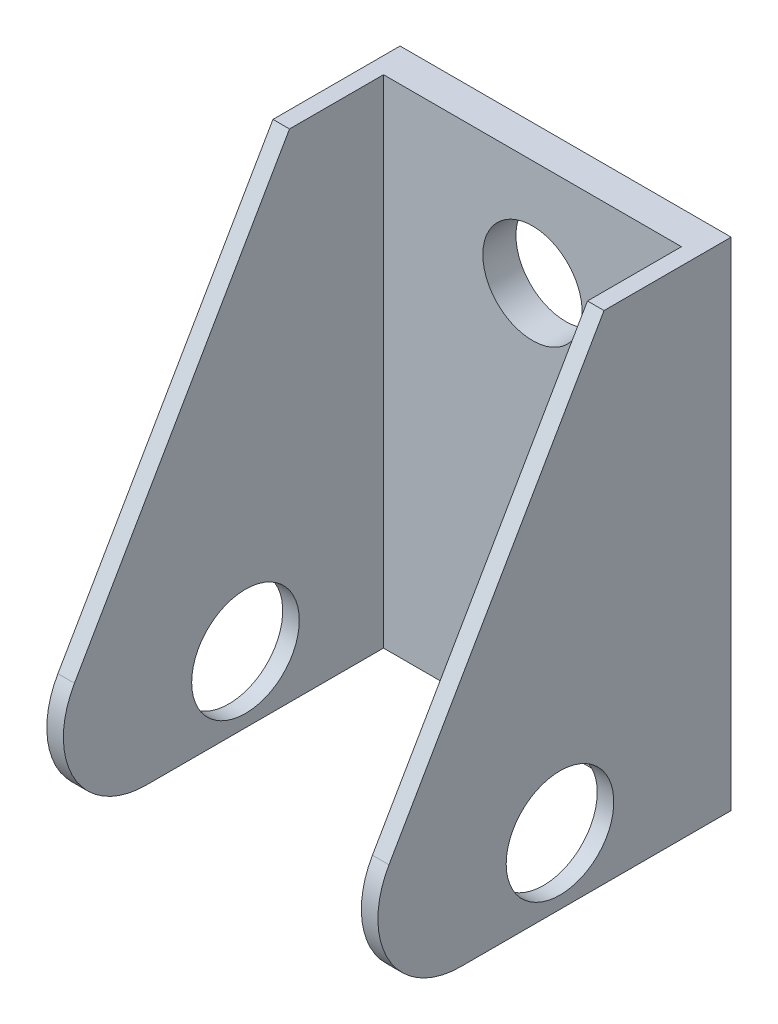
ISO-10303-21;
HEADER;
FILE_DESCRIPTION(('STEP AP214'),'2;1');
FILE_NAME('part.step','',(''),(''),'','','');
FILE_SCHEMA(('AUTOMOTIVE_DESIGN { 1 0 10303 214 1 1 1 1 }'));
ENDSEC;
DATA;
#1=APPLICATION_CONTEXT('core data for automotive mechanical design processes');
#2=APPLICATION_PROTOCOL_DEFINITION('international standard','automotive_design',2000,#1);
#3=PRODUCT_CONTEXT('',#1,'mechanical');
#4=PRODUCT('Part','Part','',(#3));
#5=PRODUCT_RELATED_PRODUCT_CATEGORY('part','',(#4));
#6=PRODUCT_DEFINITION_FORMATION('','',#4);
#7=PRODUCT_DEFINITION_CONTEXT('part definition',#1,'design');
#8=PRODUCT_DEFINITION('design','',#6,#7);
#9=PRODUCT_DEFINITION_SHAPE('','',#8);
#10=(LENGTH_UNIT() NAMED_UNIT(*) SI_UNIT(.MILLI.,.METRE.));
#11=(NAMED_UNIT(*) PLANE_ANGLE_UNIT() SI_UNIT($,.RADIAN.));
#12=(NAMED_UNIT(*) SI_UNIT($,.STERADIAN.) SOLID_ANGLE_UNIT());
#13=UNCERTAINTY_MEASURE_WITH_UNIT(LENGTH_MEASURE(1.E-05),#10,'distance_accuracy_value','');
#14=(GEOMETRIC_REPRESENTATION_CONTEXT(3) GLOBAL_UNCERTAINTY_ASSIGNED_CONTEXT((#13)) GLOBAL_UNIT_ASSIGNED_CONTEXT((#10,
#11,#12)) REPRESENTATION_CONTEXT('',''));
#15=CARTESIAN_POINT('',(0.,0.,0.));
#16=DIRECTION('',(0.,0.,1.));
#17=DIRECTION('',(1.,0.,0.));
#18=AXIS2_PLACEMENT_3D('',#15,#16,#17);
#19=CARTESIAN_POINT('',(10.,-15.,2.));
#20=DIRECTION('',(-1.,0.,0.));
#21=DIRECTION('',(0.,0.,1.));
#22=AXIS2_PLACEMENT_3D('',#19,#20,#21);
#23=PLANE('',#22);
#24=CARTESIAN_POINT('',(10.,-11.,10.3397459621556));
#25=DIRECTION('',(-1.,0.,0.));
#26=DIRECTION('',(0.,0.,1.));
#27=AXIS2_PLACEMENT_3D('',#24,#25,#26);
#28=CIRCLE('',#27,3.25);
#29=CARTESIAN_POINT('',(10.,-11.,13.5897459621556));
#30=VERTEX_POINT('',#29);
#31=EDGE_CURVE('E308',#30,#30,#28,.T.);
#32=ORIENTED_EDGE('',*,*,#31,.T.);
#33=EDGE_LOOP('',(#32));
#34=FACE_BOUND('',#33,.T.);
#35=DIRECTION('',(0.,-0.866025403784436,0.500000000000004));
#36=VECTOR('',#35,1.);
#37=CARTESIAN_POINT('',(10.,-15.,25.));
#38=LINE('',#37,#36);
#39=CARTESIAN_POINT('',(10.,15.,7.67949192431104));
#40=VERTEX_POINT('',#39);
#41=CARTESIAN_POINT('',(10.,-7.49999999999998,20.6698729810777));
#42=VERTEX_POINT('',#41);
#43=EDGE_CURVE('E141',#40,#42,#38,.T.);
#44=ORIENTED_EDGE('',*,*,#43,.T.);
#45=CARTESIAN_POINT('',(10.,-9.99999999999999,16.3397459621556));
#46=DIRECTION('',(-1.,0.,0.));
#47=DIRECTION('',(0.,0.,1.));
#48=AXIS2_PLACEMENT_3D('',#45,#46,#47);
#49=CIRCLE('',#48,5.);
#50=CARTESIAN_POINT('',(10.,-15.,16.3397459621556));
#51=VERTEX_POINT('',#50);
#52=EDGE_CURVE('E63',#42,#51,#49,.F.);
#53=ORIENTED_EDGE('',*,*,#52,.T.);
#54=DIRECTION('',(0.,0.,-1.));
#55=VECTOR('',#54,1.);
#56=CARTESIAN_POINT('',(10.,-15.,2.));
#57=LINE('',#56,#55);
#58=CARTESIAN_POINT('',(10.,-15.,0.));
#59=VERTEX_POINT('',#58);
#60=EDGE_CURVE('E195',#51,#59,#57,.T.);
#61=ORIENTED_EDGE('',*,*,#60,.T.);
#62=DIRECTION('',(0.,1.,0.));
#63=VECTOR('',#62,1.);
#64=CARTESIAN_POINT('',(10.,-15.,0.));
#65=LINE('',#64,#63);
#66=CARTESIAN_POINT('',(10.,15.,0.));
#67=VERTEX_POINT('',#66);
#68=EDGE_CURVE('E185',#59,#67,#65,.T.);
#69=ORIENTED_EDGE('',*,*,#68,.T.);
#70=DIRECTION('',(0.,0.,-1.));
#71=VECTOR('',#70,1.);
#72=CARTESIAN_POINT('',(10.,15.,2.));
#73=LINE('',#72,#71);
#74=EDGE_CURVE('E128',#40,#67,#73,.T.);
#75=ORIENTED_EDGE('',*,*,#74,.F.);
#76=EDGE_LOOP('',(#44,#53,#61,#69,#75));
#77=FACE_BOUND('',#76,.T.);
#78=ADVANCED_FACE('F39',(#34,#77),#23,.F.);
#79=CARTESIAN_POINT('',(-10.,15.,2.));
#80=DIRECTION('',(0.,-1.,0.));
#81=DIRECTION('',(0.,0.,-1.));
#82=AXIS2_PLACEMENT_3D('',#79,#80,#81);
#83=PLANE('',#82);
#84=DIRECTION('',(-1.,0.,0.));
#85=VECTOR('',#84,1.);
#86=CARTESIAN_POINT('',(-10.,15.,0.));
#87=LINE('',#86,#85);
#88=CARTESIAN_POINT('',(-10.,15.,0.));
#89=VERTEX_POINT('',#88);
#90=EDGE_CURVE('E122',#67,#89,#87,.T.);
#91=ORIENTED_EDGE('',*,*,#90,.T.);
#92=DIRECTION('',(0.,0.,-1.));
#93=VECTOR('',#92,1.);
#94=CARTESIAN_POINT('',(-10.,15.,2.));
#95=LINE('',#94,#93);
#96=CARTESIAN_POINT('',(-10.,15.,7.67949192431104));
#97=VERTEX_POINT('',#96);
#98=EDGE_CURVE('E115',#97,#89,#95,.T.);
#99=ORIENTED_EDGE('',*,*,#98,.F.);
#100=DIRECTION('',(1.,0.,0.));
#101=VECTOR('',#100,1.);
#102=CARTESIAN_POINT('',(-10.,15.,7.67949192431104));
#103=LINE('',#102,#101);
#104=CARTESIAN_POINT('',(-9.,15.,7.67949192431104));
#105=VERTEX_POINT('',#104);
#106=EDGE_CURVE('E119',#97,#105,#103,.T.);
#107=ORIENTED_EDGE('',*,*,#106,.T.);
#108=DIRECTION('',(0.,0.,1.));
#109=VECTOR('',#108,1.);
#110=CARTESIAN_POINT('',(-9.,15.,2.));
#111=LINE('',#110,#109);
#112=CARTESIAN_POINT('',(-9.,15.,2.));
#113=VERTEX_POINT('',#112);
#114=EDGE_CURVE('E148',#113,#105,#111,.T.);
#115=ORIENTED_EDGE('',*,*,#114,.F.);
#116=DIRECTION('',(-1.,0.,0.));
#117=VECTOR('',#116,1.);
#118=CARTESIAN_POINT('',(-10.,15.,2.));
#119=LINE('',#118,#117);
#120=CARTESIAN_POINT('',(9.,15.,2.));
#121=VERTEX_POINT('',#120);
#122=EDGE_CURVE('E186',#121,#113,#119,.T.);
#123=ORIENTED_EDGE('',*,*,#122,.F.);
#124=DIRECTION('',(0.,0.,1.));
#125=VECTOR('',#124,1.);
#126=CARTESIAN_POINT('',(9.,15.,2.));
#127=LINE('',#126,#125);
#128=CARTESIAN_POINT('',(9.,15.,7.67949192431104));
#129=VERTEX_POINT('',#128);
#130=EDGE_CURVE('E175',#121,#129,#127,.T.);
#131=ORIENTED_EDGE('',*,*,#130,.T.);
#132=DIRECTION('',(1.,0.,0.));
#133=VECTOR('',#132,1.);
#134=CARTESIAN_POINT('',(9.,15.,7.67949192431104));
#135=LINE('',#134,#133);
#136=EDGE_CURVE('E179',#129,#40,#135,.T.);
#137=ORIENTED_EDGE('',*,*,#136,.T.);
#138=ORIENTED_EDGE('',*,*,#74,.T.);
#139=EDGE_LOOP('',(#91,#99,#107,#115,#123,#131,#137,#138));
#140=FACE_BOUND('',#139,.T.);
#141=ADVANCED_FACE('F117',(#140),#83,.F.);
#142=CARTESIAN_POINT('',(-10.,-15.,2.));
#143=DIRECTION('',(1.,0.,0.));
#144=DIRECTION('',(0.,0.,-1.));
#145=AXIS2_PLACEMENT_3D('',#142,#143,#144);
#146=PLANE('',#145);
#147=CARTESIAN_POINT('',(-10.,-11.,10.3397459621556));
#148=DIRECTION('',(-1.,0.,0.));
#149=DIRECTION('',(0.,0.,1.));
#150=AXIS2_PLACEMENT_3D('',#147,#148,#149);
#151=CIRCLE('',#150,3.25);
#152=CARTESIAN_POINT('',(-10.,-11.,13.5897459621556));
#153=VERTEX_POINT('',#152);
#154=EDGE_CURVE('E303',#153,#153,#151,.T.);
#155=ORIENTED_EDGE('',*,*,#154,.F.);
#156=EDGE_LOOP('',(#155));
#157=FACE_BOUND('',#156,.T.);
#158=DIRECTION('',(0.,0.,-1.));
#159=VECTOR('',#158,1.);
#160=CARTESIAN_POINT('',(-10.,-15.,2.));
#161=LINE('',#160,#159);
#162=CARTESIAN_POINT('',(-10.,-15.,16.3397459621556));
#163=VERTEX_POINT('',#162);
#164=CARTESIAN_POINT('',(-10.,-15.,0.));
#165=VERTEX_POINT('',#164);
#166=EDGE_CURVE('E129',#163,#165,#161,.T.);
#167=ORIENTED_EDGE('',*,*,#166,.F.);
#168=CARTESIAN_POINT('',(-10.,-9.99999999999999,16.3397459621556));
#169=DIRECTION('',(1.,0.,0.));
#170=DIRECTION('',(0.,0.,-1.));
#171=AXIS2_PLACEMENT_3D('',#168,#169,#170);
#172=CIRCLE('',#171,5.);
#173=CARTESIAN_POINT('',(-10.,-7.49999999999998,20.6698729810777));
#174=VERTEX_POINT('',#173);
#175=EDGE_CURVE('E146',#163,#174,#172,.F.);
#176=ORIENTED_EDGE('',*,*,#175,.T.);
#177=DIRECTION('',(0.,-0.866025403784436,0.500000000000004));
#178=VECTOR('',#177,1.);
#179=CARTESIAN_POINT('',(-10.,-15.,25.));
#180=LINE('',#179,#178);
#181=EDGE_CURVE('E135',#97,#174,#180,.T.);
#182=ORIENTED_EDGE('',*,*,#181,.F.);
#183=ORIENTED_EDGE('',*,*,#98,.T.);
#184=DIRECTION('',(0.,-1.,0.));
#185=VECTOR('',#184,1.);
#186=CARTESIAN_POINT('',(-10.,-15.,0.));
#187=LINE('',#186,#185);
#188=EDGE_CURVE('E201',#89,#165,#187,.T.);
#189=ORIENTED_EDGE('',*,*,#188,.T.);
#190=EDGE_LOOP('',(#167,#176,#182,#183,#189));
#191=FACE_BOUND('',#190,.T.);
#192=ADVANCED_FACE('F144',(#157,#191),#146,.F.);
#193=CARTESIAN_POINT('',(-10.,-15.,2.));
#194=DIRECTION('',(0.,1.,0.));
#195=DIRECTION('',(0.,0.,1.));
#196=AXIS2_PLACEMENT_3D('',#193,#194,#195);
#197=PLANE('',#196);
#198=ORIENTED_EDGE('',*,*,#60,.F.);
#199=DIRECTION('',(1.,0.,0.));
#200=VECTOR('',#199,1.);
#201=CARTESIAN_POINT('',(9.,-15.,16.3397459621556));
#202=LINE('',#201,#200);
#203=CARTESIAN_POINT('',(9.,-15.,16.3397459621556));
#204=VERTEX_POINT('',#203);
#205=EDGE_CURVE('E49',#51,#204,#202,.F.);
#206=ORIENTED_EDGE('',*,*,#205,.T.);
#207=DIRECTION('',(0.,0.,-1.));
#208=VECTOR('',#207,1.);
#209=CARTESIAN_POINT('',(9.,-15.,2.));
#210=LINE('',#209,#208);
#211=CARTESIAN_POINT('',(9.,-15.,2.));
#212=VERTEX_POINT('',#211);
#213=EDGE_CURVE('E168',#204,#212,#210,.T.);
#214=ORIENTED_EDGE('',*,*,#213,.T.);
#215=DIRECTION('',(1.,0.,0.));
#216=VECTOR('',#215,1.);
#217=CARTESIAN_POINT('',(-10.,-15.,2.));
#218=LINE('',#217,#216);
#219=CARTESIAN_POINT('',(-9.,-15.,2.));
#220=VERTEX_POINT('',#219);
#221=EDGE_CURVE('E190',#220,#212,#218,.T.);
#222=ORIENTED_EDGE('',*,*,#221,.F.);
#223=DIRECTION('',(0.,0.,-1.));
#224=VECTOR('',#223,1.);
#225=CARTESIAN_POINT('',(-9.,-15.,2.));
#226=LINE('',#225,#224);
#227=CARTESIAN_POINT('',(-9.,-15.,16.3397459621556));
#228=VERTEX_POINT('',#227);
#229=EDGE_CURVE('E159',#228,#220,#226,.T.);
#230=ORIENTED_EDGE('',*,*,#229,.F.);
#231=DIRECTION('',(1.,0.,0.));
#232=VECTOR('',#231,1.);
#233=CARTESIAN_POINT('',(-10.,-15.,16.3397459621556));
#234=LINE('',#233,#232);
#235=EDGE_CURVE('E219',#228,#163,#234,.F.);
#236=ORIENTED_EDGE('',*,*,#235,.T.);
#237=ORIENTED_EDGE('',*,*,#166,.T.);
#238=DIRECTION('',(1.,0.,0.));
#239=VECTOR('',#238,1.);
#240=CARTESIAN_POINT('',(-10.,-15.,0.));
#241=LINE('',#240,#239);
#242=EDGE_CURVE('E191',#165,#59,#241,.T.);
#243=ORIENTED_EDGE('',*,*,#242,.T.);
#244=EDGE_LOOP('',(#198,#206,#214,#222,#230,#236,#237,#243));
#245=FACE_BOUND('',#244,.T.);
#246=ADVANCED_FACE('F266',(#245),#197,.F.);
#247=CARTESIAN_POINT('',(0.,0.,2.));
#248=DIRECTION('',(0.,0.,-1.));
#249=DIRECTION('',(-1.,0.,0.));
#250=AXIS2_PLACEMENT_3D('',#247,#248,#249);
#251=PLANE('',#250);
#252=CARTESIAN_POINT('',(0.,8.58887652225349,2.));
#253=DIRECTION('',(0.,0.,-1.));
#254=DIRECTION('',(-1.,0.,0.));
#255=AXIS2_PLACEMENT_3D('',#252,#253,#254);
#256=CIRCLE('',#255,3.);
#257=CARTESIAN_POINT('',(-3.,8.58887652225349,2.));
#258=VERTEX_POINT('',#257);
#259=EDGE_CURVE('E301',#258,#258,#256,.T.);
#260=ORIENTED_EDGE('',*,*,#259,.T.);
#261=EDGE_LOOP('',(#260));
#262=FACE_BOUND('',#261,.T.);
#263=ORIENTED_EDGE('',*,*,#122,.T.);
#264=DIRECTION('',(0.,1.,0.));
#265=VECTOR('',#264,1.);
#266=CARTESIAN_POINT('',(-9.,15.,2.));
#267=LINE('',#266,#265);
#268=EDGE_CURVE('E151',#220,#113,#267,.T.);
#269=ORIENTED_EDGE('',*,*,#268,.F.);
#270=ORIENTED_EDGE('',*,*,#221,.T.);
#271=DIRECTION('',(0.,1.,0.));
#272=VECTOR('',#271,1.);
#273=CARTESIAN_POINT('',(9.,15.,2.));
#274=LINE('',#273,#272);
#275=EDGE_CURVE('E171',#212,#121,#274,.T.);
#276=ORIENTED_EDGE('',*,*,#275,.T.);
#277=EDGE_LOOP('',(#263,#269,#270,#276));
#278=FACE_BOUND('',#277,.T.);
#279=ADVANCED_FACE('F270',(#262,#278),#251,.F.);
#280=CARTESIAN_POINT('',(0.,0.,0.));
#281=DIRECTION('',(0.,0.,-1.));
#282=DIRECTION('',(-1.,0.,0.));
#283=AXIS2_PLACEMENT_3D('',#280,#281,#282);
#284=PLANE('',#283);
#285=CARTESIAN_POINT('',(0.,8.58887652225349,0.));
#286=DIRECTION('',(0.,0.,-1.));
#287=DIRECTION('',(-1.,0.,0.));
#288=AXIS2_PLACEMENT_3D('',#285,#286,#287);
#289=CIRCLE('',#288,3.);
#290=CARTESIAN_POINT('',(-3.,8.58887652225349,0.));
#291=VERTEX_POINT('',#290);
#292=EDGE_CURVE('E298',#291,#291,#289,.T.);
#293=ORIENTED_EDGE('',*,*,#292,.F.);
#294=EDGE_LOOP('',(#293));
#295=FACE_BOUND('',#294,.T.);
#296=ORIENTED_EDGE('',*,*,#68,.F.);
#297=ORIENTED_EDGE('',*,*,#242,.F.);
#298=ORIENTED_EDGE('',*,*,#188,.F.);
#299=ORIENTED_EDGE('',*,*,#90,.F.);
#300=EDGE_LOOP('',(#296,#297,#298,#299));
#301=FACE_BOUND('',#300,.T.);
#302=ADVANCED_FACE('F271',(#295,#301),#284,.T.);
#303=CARTESIAN_POINT('',(9.,-15.,25.));
#304=DIRECTION('',(0.,0.500000000000004,0.866025403784436));
#305=DIRECTION('',(0.,-0.866025403784436,0.500000000000004));
#306=AXIS2_PLACEMENT_3D('',#303,#304,#305);
#307=PLANE('',#306);
#308=DIRECTION('',(0.,-0.866025403784436,0.500000000000004));
#309=VECTOR('',#308,1.);
#310=CARTESIAN_POINT('',(9.,-15.,25.));
#311=LINE('',#310,#309);
#312=CARTESIAN_POINT('',(9.,-7.49999999999998,20.6698729810777));
#313=VERTEX_POINT('',#312);
#314=EDGE_CURVE('E164',#129,#313,#311,.T.);
#315=ORIENTED_EDGE('',*,*,#314,.T.);
#316=DIRECTION('',(1.,0.,0.));
#317=VECTOR('',#316,1.);
#318=CARTESIAN_POINT('',(10.,-7.49999999999997,20.6698729810777));
#319=LINE('',#318,#317);
#320=EDGE_CURVE('E224',#313,#42,#319,.T.);
#321=ORIENTED_EDGE('',*,*,#320,.T.);
#322=ORIENTED_EDGE('',*,*,#43,.F.);
#323=ORIENTED_EDGE('',*,*,#136,.F.);
#324=EDGE_LOOP('',(#315,#321,#322,#323));
#325=FACE_BOUND('',#324,.T.);
#326=ADVANCED_FACE('F234',(#325),#307,.T.);
#327=CARTESIAN_POINT('',(9.,0.,0.));
#328=DIRECTION('',(1.,0.,0.));
#329=DIRECTION('',(0.,0.,-1.));
#330=AXIS2_PLACEMENT_3D('',#327,#328,#329);
#331=PLANE('',#330);
#332=CARTESIAN_POINT('',(9.,-11.,10.3397459621556));
#333=DIRECTION('',(1.,0.,0.));
#334=DIRECTION('',(0.,0.,-1.));
#335=AXIS2_PLACEMENT_3D('',#332,#333,#334);
#336=CIRCLE('',#335,3.25);
#337=CARTESIAN_POINT('',(9.,-11.,7.08974596215556));
#338=VERTEX_POINT('',#337);
#339=EDGE_CURVE('E155',#338,#338,#336,.T.);
#340=ORIENTED_EDGE('',*,*,#339,.T.);
#341=EDGE_LOOP('',(#340));
#342=FACE_BOUND('',#341,.T.);
#343=ORIENTED_EDGE('',*,*,#213,.F.);
#344=CARTESIAN_POINT('',(9.,-9.99999999999999,16.3397459621556));
#345=DIRECTION('',(1.,0.,0.));
#346=DIRECTION('',(0.,0.,-1.));
#347=AXIS2_PLACEMENT_3D('',#344,#345,#346);
#348=CIRCLE('',#347,5.);
#349=EDGE_CURVE('E11',#204,#313,#348,.F.);
#350=ORIENTED_EDGE('',*,*,#349,.T.);
#351=ORIENTED_EDGE('',*,*,#314,.F.);
#352=ORIENTED_EDGE('',*,*,#130,.F.);
#353=ORIENTED_EDGE('',*,*,#275,.F.);
#354=EDGE_LOOP('',(#343,#350,#351,#352,#353));
#355=FACE_BOUND('',#354,.T.);
#356=ADVANCED_FACE('F241',(#342,#355),#331,.F.);
#357=CARTESIAN_POINT('',(-10.,-15.,25.));
#358=DIRECTION('',(0.,0.500000000000004,0.866025403784436));
#359=DIRECTION('',(0.,-0.866025403784436,0.500000000000004));
#360=AXIS2_PLACEMENT_3D('',#357,#358,#359);
#361=PLANE('',#360);
#362=ORIENTED_EDGE('',*,*,#181,.T.);
#363=DIRECTION('',(1.,0.,0.));
#364=VECTOR('',#363,1.);
#365=CARTESIAN_POINT('',(-9.,-7.49999999999997,20.6698729810777));
#366=LINE('',#365,#364);
#367=CARTESIAN_POINT('',(-9.,-7.49999999999998,20.6698729810777));
#368=VERTEX_POINT('',#367);
#369=EDGE_CURVE('E213',#174,#368,#366,.T.);
#370=ORIENTED_EDGE('',*,*,#369,.T.);
#371=DIRECTION('',(0.,-0.866025403784436,0.500000000000004));
#372=VECTOR('',#371,1.);
#373=CARTESIAN_POINT('',(-9.,-15.,25.));
#374=LINE('',#373,#372);
#375=EDGE_CURVE('E138',#105,#368,#374,.T.);
#376=ORIENTED_EDGE('',*,*,#375,.F.);
#377=ORIENTED_EDGE('',*,*,#106,.F.);
#378=EDGE_LOOP('',(#362,#370,#376,#377));
#379=FACE_BOUND('',#378,.T.);
#380=ADVANCED_FACE('F133',(#379),#361,.T.);
#381=CARTESIAN_POINT('',(-9.,0.,0.));
#382=DIRECTION('',(1.,0.,0.));
#383=DIRECTION('',(0.,0.,-1.));
#384=AXIS2_PLACEMENT_3D('',#381,#382,#383);
#385=PLANE('',#384);
#386=CARTESIAN_POINT('',(-9.,-11.,10.3397459621556));
#387=DIRECTION('',(1.,0.,0.));
#388=DIRECTION('',(0.,0.,-1.));
#389=AXIS2_PLACEMENT_3D('',#386,#387,#388);
#390=CIRCLE('',#389,3.25);
#391=CARTESIAN_POINT('',(-9.,-11.,7.08974596215556));
#392=VERTEX_POINT('',#391);
#393=EDGE_CURVE('E43',#392,#392,#390,.T.);
#394=ORIENTED_EDGE('',*,*,#393,.F.);
#395=EDGE_LOOP('',(#394));
#396=FACE_BOUND('',#395,.T.);
#397=ORIENTED_EDGE('',*,*,#375,.T.);
#398=CARTESIAN_POINT('',(-9.,-9.99999999999999,16.3397459621556));
#399=DIRECTION('',(1.,0.,0.));
#400=DIRECTION('',(0.,0.,-1.));
#401=AXIS2_PLACEMENT_3D('',#398,#399,#400);
#402=CIRCLE('',#401,5.);
#403=EDGE_CURVE('E216',#368,#228,#402,.T.);
#404=ORIENTED_EDGE('',*,*,#403,.T.);
#405=ORIENTED_EDGE('',*,*,#229,.T.);
#406=ORIENTED_EDGE('',*,*,#268,.T.);
#407=ORIENTED_EDGE('',*,*,#114,.T.);
#408=EDGE_LOOP('',(#397,#404,#405,#406,#407));
#409=FACE_BOUND('',#408,.T.);
#410=ADVANCED_FACE('F253',(#396,#409),#385,.T.);
#411=CARTESIAN_POINT('',(-10.,-9.99999999999999,16.3397459621556));
#412=DIRECTION('',(-1.,0.,0.));
#413=DIRECTION('',(0.,0.,1.));
#414=AXIS2_PLACEMENT_3D('',#411,#412,#413);
#415=CYLINDRICAL_SURFACE('',#414,5.);
#416=ORIENTED_EDGE('',*,*,#175,.F.);
#417=ORIENTED_EDGE('',*,*,#235,.F.);
#418=ORIENTED_EDGE('',*,*,#403,.F.);
#419=ORIENTED_EDGE('',*,*,#369,.F.);
#420=EDGE_LOOP('',(#416,#417,#418,#419));
#421=FACE_BOUND('',#420,.T.);
#422=ADVANCED_FACE('F245',(#421),#415,.T.);
#423=CARTESIAN_POINT('',(9.,-9.99999999999999,16.3397459621556));
#424=DIRECTION('',(-1.,0.,0.));
#425=DIRECTION('',(0.,0.,1.));
#426=AXIS2_PLACEMENT_3D('',#423,#424,#425);
#427=CYLINDRICAL_SURFACE('',#426,5.);
#428=ORIENTED_EDGE('',*,*,#349,.F.);
#429=ORIENTED_EDGE('',*,*,#205,.F.);
#430=ORIENTED_EDGE('',*,*,#52,.F.);
#431=ORIENTED_EDGE('',*,*,#320,.F.);
#432=EDGE_LOOP('',(#428,#429,#430,#431));
#433=FACE_BOUND('',#432,.T.);
#434=ADVANCED_FACE('F41',(#433),#427,.T.);
#435=CARTESIAN_POINT('',(10.,-11.,10.3397459621556));
#436=DIRECTION('',(-1.,0.,0.));
#437=DIRECTION('',(0.,0.,1.));
#438=AXIS2_PLACEMENT_3D('',#435,#436,#437);
#439=CYLINDRICAL_SURFACE('',#438,3.25);
#440=ORIENTED_EDGE('',*,*,#393,.T.);
#441=EDGE_LOOP('',(#440));
#442=FACE_BOUND('',#441,.T.);
#443=ORIENTED_EDGE('',*,*,#154,.T.);
#444=EDGE_LOOP('',(#443));
#445=FACE_BOUND('',#444,.T.);
#446=ADVANCED_FACE('F244',(#442,#445),#439,.F.);
#447=ORIENTED_EDGE('',*,*,#31,.F.);
#448=EDGE_LOOP('',(#447));
#449=FACE_BOUND('',#448,.T.);
#450=ORIENTED_EDGE('',*,*,#339,.F.);
#451=EDGE_LOOP('',(#450));
#452=FACE_BOUND('',#451,.T.);
#453=ADVANCED_FACE('F250',(#449,#452),#439,.F.);
#454=CARTESIAN_POINT('',(0.,8.58887652225349,21.3397459621556));
#455=DIRECTION('',(0.,0.,-1.));
#456=DIRECTION('',(-1.,0.,0.));
#457=AXIS2_PLACEMENT_3D('',#454,#455,#456);
#458=CYLINDRICAL_SURFACE('',#457,3.);
#459=ORIENTED_EDGE('',*,*,#292,.T.);
#460=EDGE_LOOP('',(#459));
#461=FACE_BOUND('',#460,.T.);
#462=ORIENTED_EDGE('',*,*,#259,.F.);
#463=EDGE_LOOP('',(#462));
#464=FACE_BOUND('',#463,.T.);
#465=ADVANCED_FACE('F288',(#461,#464),#458,.F.);
#466=CLOSED_SHELL('',(#78,#141,#192,#246,#279,#302,#326,#356,#380,#410,#422,#434,#446,#453,#465));
#467=MANIFOLD_SOLID_BREP('B2',#466);
#468=ADVANCED_BREP_SHAPE_REPRESENTATION('',(#18,#467),#14);
#469=SHAPE_DEFINITION_REPRESENTATION(#9,#468);
ENDSEC;
END-ISO-10303-21;
